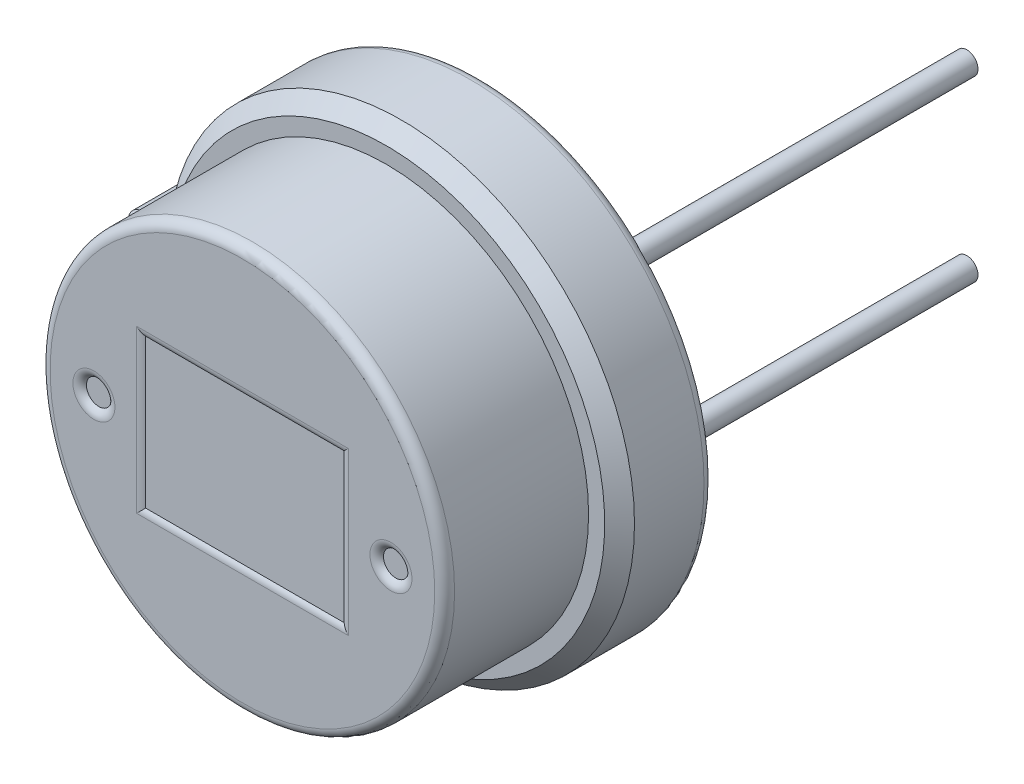
ISO-10303-21;
HEADER;
FILE_DESCRIPTION(('STEP AP214'),'2;1');
FILE_NAME('part.step','',(''),(''),'','','');
FILE_SCHEMA(('AUTOMOTIVE_DESIGN { 1 0 10303 214 1 1 1 1 }'));
ENDSEC;
DATA;
#1=APPLICATION_CONTEXT('core data for automotive mechanical design processes');
#2=APPLICATION_PROTOCOL_DEFINITION('international standard','automotive_design',2000,#1);
#3=PRODUCT_CONTEXT('',#1,'mechanical');
#4=PRODUCT('Part','Part','',(#3));
#5=PRODUCT_RELATED_PRODUCT_CATEGORY('part','',(#4));
#6=PRODUCT_DEFINITION_FORMATION('','',#4);
#7=PRODUCT_DEFINITION_CONTEXT('part definition',#1,'design');
#8=PRODUCT_DEFINITION('design','',#6,#7);
#9=PRODUCT_DEFINITION_SHAPE('','',#8);
#10=(LENGTH_UNIT() NAMED_UNIT(*) SI_UNIT(.MILLI.,.METRE.));
#11=(NAMED_UNIT(*) PLANE_ANGLE_UNIT() SI_UNIT($,.RADIAN.));
#12=(NAMED_UNIT(*) SI_UNIT($,.STERADIAN.) SOLID_ANGLE_UNIT());
#13=UNCERTAINTY_MEASURE_WITH_UNIT(LENGTH_MEASURE(1.E-05),#10,'distance_accuracy_value','');
#14=(GEOMETRIC_REPRESENTATION_CONTEXT(3) GLOBAL_UNCERTAINTY_ASSIGNED_CONTEXT((#13)) GLOBAL_UNIT_ASSIGNED_CONTEXT((#10,
#11,#12)) REPRESENTATION_CONTEXT('',''));
#15=CARTESIAN_POINT('',(0.,0.,0.));
#16=DIRECTION('',(0.,0.,1.));
#17=DIRECTION('',(1.,0.,0.));
#18=AXIS2_PLACEMENT_3D('',#15,#16,#17);
#19=CARTESIAN_POINT('',(-4.93558507170123,-0.800000000000001,1.9));
#20=DIRECTION('',(0.,0.,-1.));
#21=DIRECTION('',(-1.,0.,0.));
#22=AXIS2_PLACEMENT_3D('',#19,#20,#21);
#23=CYLINDRICAL_SURFACE('',#22,0.3);
#24=DIRECTION('',(0.,0.,-1.));
#25=VECTOR('',#24,1.);
#26=CARTESIAN_POINT('',(-4.93558507170123,-0.500000000000002,1.9));
#27=LINE('',#26,#25);
#28=CARTESIAN_POINT('',(-4.93558507170123,-0.500000000000002,1.60000000000001));
#29=VERTEX_POINT('',#28);
#30=CARTESIAN_POINT('',(-4.93558507170123,-0.500000000000002,0.200000000000001));
#31=VERTEX_POINT('',#30);
#32=EDGE_CURVE('E209',#29,#31,#27,.T.);
#33=ORIENTED_EDGE('',*,*,#32,.T.);
#34=CARTESIAN_POINT('',(-4.93558507170123,-0.800000000000001,0.2));
#35=DIRECTION('',(0.,0.,1.));
#36=DIRECTION('',(1.,0.,0.));
#37=AXIS2_PLACEMENT_3D('',#34,#35,#36);
#38=CIRCLE('',#37,0.3);
#39=CARTESIAN_POINT('',(-4.63944996739915,-0.752000000000001,0.200000000000001));
#40=VERTEX_POINT('',#39);
#41=EDGE_CURVE('E301',#31,#40,#38,.F.);
#42=ORIENTED_EDGE('',*,*,#41,.T.);
#43=DIRECTION('',(0.,0.,-1.));
#44=VECTOR('',#43,1.);
#45=CARTESIAN_POINT('',(-4.63944996739915,-0.752000000000001,1.9));
#46=LINE('',#45,#44);
#47=CARTESIAN_POINT('',(-4.63944996739915,-0.752000000000001,1.60000000000001));
#48=VERTEX_POINT('',#47);
#49=EDGE_CURVE('E215',#48,#40,#46,.T.);
#50=ORIENTED_EDGE('',*,*,#49,.F.);
#51=CARTESIAN_POINT('',(-4.93558507170123,-0.800000000000001,1.60000000000001));
#52=DIRECTION('',(0.,0.,1.));
#53=DIRECTION('',(1.,0.,0.));
#54=AXIS2_PLACEMENT_3D('',#51,#52,#53);
#55=CIRCLE('',#54,0.3);
#56=EDGE_CURVE('E292',#48,#29,#55,.T.);
#57=ORIENTED_EDGE('',*,*,#56,.T.);
#58=EDGE_LOOP('',(#33,#42,#50,#57));
#59=FACE_BOUND('',#58,.T.);
#60=ADVANCED_FACE('F40',(#59),#23,.F.);
#61=CARTESIAN_POINT('',(0.,0.,1.9));
#62=DIRECTION('',(0.,0.,-1.));
#63=DIRECTION('',(-1.,0.,0.));
#64=AXIS2_PLACEMENT_3D('',#61,#62,#63);
#65=CYLINDRICAL_SURFACE('',#64,4.7);
#66=ORIENTED_EDGE('',*,*,#49,.T.);
#67=CARTESIAN_POINT('',(0.,0.,0.2));
#68=DIRECTION('',(0.,0.,1.));
#69=DIRECTION('',(1.,0.,0.));
#70=AXIS2_PLACEMENT_3D('',#67,#68,#69);
#71=CIRCLE('',#70,4.7);
#72=CARTESIAN_POINT('',(-4.63944996739915,0.751999999999998,0.200000000000001));
#73=VERTEX_POINT('',#72);
#74=EDGE_CURVE('E11',#40,#73,#71,.T.);
#75=ORIENTED_EDGE('',*,*,#74,.T.);
#76=DIRECTION('',(0.,0.,-1.));
#77=VECTOR('',#76,1.);
#78=CARTESIAN_POINT('',(-4.63944996739915,0.751999999999998,1.9));
#79=LINE('',#78,#77);
#80=CARTESIAN_POINT('',(-4.63944996739915,0.751999999999998,1.60000000000001));
#81=VERTEX_POINT('',#80);
#82=EDGE_CURVE('E239',#81,#73,#79,.T.);
#83=ORIENTED_EDGE('',*,*,#82,.F.);
#84=CARTESIAN_POINT('',(0.,0.,1.60000000000001));
#85=DIRECTION('',(0.,0.,1.));
#86=DIRECTION('',(1.,0.,0.));
#87=AXIS2_PLACEMENT_3D('',#84,#85,#86);
#88=CIRCLE('',#87,4.7);
#89=EDGE_CURVE('E298',#81,#48,#88,.F.);
#90=ORIENTED_EDGE('',*,*,#89,.T.);
#91=EDGE_LOOP('',(#66,#75,#83,#90));
#92=FACE_BOUND('',#91,.T.);
#93=ADVANCED_FACE('F449',(#92),#65,.T.);
#94=CARTESIAN_POINT('',(-4.93558507170123,0.799999999999999,1.9));
#95=DIRECTION('',(0.,0.,-1.));
#96=DIRECTION('',(-1.,0.,0.));
#97=AXIS2_PLACEMENT_3D('',#94,#95,#96);
#98=CYLINDRICAL_SURFACE('',#97,0.3);
#99=ORIENTED_EDGE('',*,*,#82,.T.);
#100=CARTESIAN_POINT('',(-4.93558507170123,0.799999999999999,0.2));
#101=DIRECTION('',(0.,0.,1.));
#102=DIRECTION('',(1.,0.,0.));
#103=AXIS2_PLACEMENT_3D('',#100,#101,#102);
#104=CIRCLE('',#103,0.3);
#105=CARTESIAN_POINT('',(-4.93558507170123,0.499999999999999,0.200000000000001));
#106=VERTEX_POINT('',#105);
#107=EDGE_CURVE('E375',#73,#106,#104,.F.);
#108=ORIENTED_EDGE('',*,*,#107,.T.);
#109=DIRECTION('',(0.,0.,-1.));
#110=VECTOR('',#109,1.);
#111=CARTESIAN_POINT('',(-4.93558507170123,0.499999999999999,1.9));
#112=LINE('',#111,#110);
#113=CARTESIAN_POINT('',(-4.93558507170123,0.499999999999999,1.60000000000001));
#114=VERTEX_POINT('',#113);
#115=EDGE_CURVE('E235',#114,#106,#112,.T.);
#116=ORIENTED_EDGE('',*,*,#115,.F.);
#117=CARTESIAN_POINT('',(-4.93558507170123,0.799999999999999,1.60000000000001));
#118=DIRECTION('',(0.,0.,1.));
#119=DIRECTION('',(1.,0.,0.));
#120=AXIS2_PLACEMENT_3D('',#117,#118,#119);
#121=CIRCLE('',#120,0.3);
#122=EDGE_CURVE('E295',#114,#81,#121,.T.);
#123=ORIENTED_EDGE('',*,*,#122,.T.);
#124=EDGE_LOOP('',(#99,#108,#116,#123));
#125=FACE_BOUND('',#124,.T.);
#126=ADVANCED_FACE('F455',(#125),#98,.F.);
#127=CARTESIAN_POINT('',(-5.2,0.499999999999999,1.9));
#128=DIRECTION('',(0.,-1.,0.));
#129=DIRECTION('',(1.,0.,0.));
#130=AXIS2_PLACEMENT_3D('',#127,#128,#129);
#131=PLANE('',#130);
#132=ORIENTED_EDGE('',*,*,#115,.T.);
#133=DIRECTION('',(-1.,0.,0.));
#134=VECTOR('',#133,1.);
#135=CARTESIAN_POINT('',(-5.2,0.499999999999999,0.2));
#136=LINE('',#135,#134);
#137=CARTESIAN_POINT('',(-5.2,0.499999999999999,0.200000000000001));
#138=VERTEX_POINT('',#137);
#139=EDGE_CURVE('E372',#106,#138,#136,.T.);
#140=ORIENTED_EDGE('',*,*,#139,.T.);
#141=DIRECTION('',(0.,0.,-1.));
#142=VECTOR('',#141,1.);
#143=CARTESIAN_POINT('',(-5.2,0.499999999999999,1.9));
#144=LINE('',#143,#142);
#145=CARTESIAN_POINT('',(-5.2,0.499999999999999,1.60000000000001));
#146=VERTEX_POINT('',#145);
#147=EDGE_CURVE('E231',#146,#138,#144,.T.);
#148=ORIENTED_EDGE('',*,*,#147,.F.);
#149=DIRECTION('',(1.,0.,0.));
#150=VECTOR('',#149,1.);
#151=CARTESIAN_POINT('',(-4.93558507170123,0.499999999999999,1.60000000000001));
#152=LINE('',#151,#150);
#153=EDGE_CURVE('E289',#146,#114,#152,.T.);
#154=ORIENTED_EDGE('',*,*,#153,.T.);
#155=EDGE_LOOP('',(#132,#140,#148,#154));
#156=FACE_BOUND('',#155,.T.);
#157=ADVANCED_FACE('F630',(#156),#131,.F.);
#158=CARTESIAN_POINT('',(-5.2,0.199999999999999,1.9));
#159=DIRECTION('',(0.,0.,-1.));
#160=DIRECTION('',(-1.,0.,0.));
#161=AXIS2_PLACEMENT_3D('',#158,#159,#160);
#162=CYLINDRICAL_SURFACE('',#161,0.3);
#163=ORIENTED_EDGE('',*,*,#147,.T.);
#164=CARTESIAN_POINT('',(-5.2,0.199999999999999,0.199999999999999));
#165=DIRECTION('',(0.,0.,1.));
#166=DIRECTION('',(1.,0.,0.));
#167=AXIS2_PLACEMENT_3D('',#164,#165,#166);
#168=CIRCLE('',#167,0.3);
#169=CARTESIAN_POINT('',(-5.5,0.199999999999997,0.2));
#170=VERTEX_POINT('',#169);
#171=EDGE_CURVE('E369',#138,#170,#168,.T.);
#172=ORIENTED_EDGE('',*,*,#171,.T.);
#173=DIRECTION('',(0.,0.,-1.));
#174=VECTOR('',#173,1.);
#175=CARTESIAN_POINT('',(-5.5,0.199999999999997,1.9));
#176=LINE('',#175,#174);
#177=CARTESIAN_POINT('',(-5.5,0.199999999999997,1.60000000000001));
#178=VERTEX_POINT('',#177);
#179=EDGE_CURVE('E227',#178,#170,#176,.T.);
#180=ORIENTED_EDGE('',*,*,#179,.F.);
#181=CARTESIAN_POINT('',(-5.2,0.199999999999999,1.60000000000001));
#182=DIRECTION('',(0.,0.,1.));
#183=DIRECTION('',(1.,0.,0.));
#184=AXIS2_PLACEMENT_3D('',#181,#182,#183);
#185=CIRCLE('',#184,0.3);
#186=EDGE_CURVE('E283',#178,#146,#185,.F.);
#187=ORIENTED_EDGE('',*,*,#186,.T.);
#188=EDGE_LOOP('',(#163,#172,#180,#187));
#189=FACE_BOUND('',#188,.T.);
#190=ADVANCED_FACE('F626',(#189),#162,.T.);
#191=CARTESIAN_POINT('',(-5.5,0.199999999999997,1.9));
#192=DIRECTION('',(1.,0.,0.));
#193=DIRECTION('',(0.,0.,-1.));
#194=AXIS2_PLACEMENT_3D('',#191,#192,#193);
#195=PLANE('',#194);
#196=ORIENTED_EDGE('',*,*,#179,.T.);
#197=DIRECTION('',(0.,-1.,0.));
#198=VECTOR('',#197,1.);
#199=CARTESIAN_POINT('',(-5.5,0.199999999999997,0.2));
#200=LINE('',#199,#198);
#201=CARTESIAN_POINT('',(-5.5,-0.199999999999999,0.200000000000001));
#202=VERTEX_POINT('',#201);
#203=EDGE_CURVE('E367',#170,#202,#200,.T.);
#204=ORIENTED_EDGE('',*,*,#203,.T.);
#205=DIRECTION('',(0.,0.,-1.));
#206=VECTOR('',#205,1.);
#207=CARTESIAN_POINT('',(-5.5,-0.199999999999999,1.9));
#208=LINE('',#207,#206);
#209=CARTESIAN_POINT('',(-5.5,-0.199999999999999,1.60000000000001));
#210=VERTEX_POINT('',#209);
#211=EDGE_CURVE('E223',#210,#202,#208,.T.);
#212=ORIENTED_EDGE('',*,*,#211,.F.);
#213=DIRECTION('',(0.,1.,0.));
#214=VECTOR('',#213,1.);
#215=CARTESIAN_POINT('',(-5.5,0.199999999999997,1.60000000000001));
#216=LINE('',#215,#214);
#217=EDGE_CURVE('E276',#210,#178,#216,.T.);
#218=ORIENTED_EDGE('',*,*,#217,.T.);
#219=EDGE_LOOP('',(#196,#204,#212,#218));
#220=FACE_BOUND('',#219,.T.);
#221=ADVANCED_FACE('F622',(#220),#195,.F.);
#222=CARTESIAN_POINT('',(-5.2,-0.200000000000002,1.9));
#223=DIRECTION('',(0.,0.,-1.));
#224=DIRECTION('',(-1.,0.,0.));
#225=AXIS2_PLACEMENT_3D('',#222,#223,#224);
#226=CYLINDRICAL_SURFACE('',#225,0.3);
#227=ORIENTED_EDGE('',*,*,#211,.T.);
#228=CARTESIAN_POINT('',(-5.2,-0.200000000000002,0.199999999999999));
#229=DIRECTION('',(0.,0.,1.));
#230=DIRECTION('',(1.,0.,0.));
#231=AXIS2_PLACEMENT_3D('',#228,#229,#230);
#232=CIRCLE('',#231,0.3);
#233=CARTESIAN_POINT('',(-5.2,-0.500000000000001,0.2));
#234=VERTEX_POINT('',#233);
#235=EDGE_CURVE('E364',#202,#234,#232,.T.);
#236=ORIENTED_EDGE('',*,*,#235,.T.);
#237=DIRECTION('',(0.,0.,-1.));
#238=VECTOR('',#237,1.);
#239=CARTESIAN_POINT('',(-5.2,-0.500000000000001,1.9));
#240=LINE('',#239,#238);
#241=CARTESIAN_POINT('',(-5.2,-0.500000000000001,1.60000000000001));
#242=VERTEX_POINT('',#241);
#243=EDGE_CURVE('E219',#242,#234,#240,.T.);
#244=ORIENTED_EDGE('',*,*,#243,.F.);
#245=CARTESIAN_POINT('',(-5.2,-0.200000000000002,1.60000000000001));
#246=DIRECTION('',(0.,0.,1.));
#247=DIRECTION('',(1.,0.,0.));
#248=AXIS2_PLACEMENT_3D('',#245,#246,#247);
#249=CIRCLE('',#248,0.3);
#250=EDGE_CURVE('E280',#242,#210,#249,.F.);
#251=ORIENTED_EDGE('',*,*,#250,.T.);
#252=EDGE_LOOP('',(#227,#236,#244,#251));
#253=FACE_BOUND('',#252,.T.);
#254=ADVANCED_FACE('F618',(#253),#226,.T.);
#255=CARTESIAN_POINT('',(-5.2,-0.500000000000001,1.9));
#256=DIRECTION('',(0.,1.,0.));
#257=DIRECTION('',(-1.,0.,0.));
#258=AXIS2_PLACEMENT_3D('',#255,#256,#257);
#259=PLANE('',#258);
#260=ORIENTED_EDGE('',*,*,#243,.T.);
#261=DIRECTION('',(1.,0.,0.));
#262=VECTOR('',#261,1.);
#263=CARTESIAN_POINT('',(-5.2,-0.500000000000001,0.2));
#264=LINE('',#263,#262);
#265=EDGE_CURVE('E361',#234,#31,#264,.T.);
#266=ORIENTED_EDGE('',*,*,#265,.T.);
#267=ORIENTED_EDGE('',*,*,#32,.F.);
#268=DIRECTION('',(-1.,0.,0.));
#269=VECTOR('',#268,1.);
#270=CARTESIAN_POINT('',(-5.2,-0.500000000000001,1.60000000000001));
#271=LINE('',#270,#269);
#272=EDGE_CURVE('E286',#29,#242,#271,.T.);
#273=ORIENTED_EDGE('',*,*,#272,.T.);
#274=EDGE_LOOP('',(#260,#266,#267,#273));
#275=FACE_BOUND('',#274,.T.);
#276=ADVANCED_FACE('F613',(#275),#259,.F.);
#277=CARTESIAN_POINT('',(-4.93558507170123,-0.800000000000001,1.9));
#278=DIRECTION('',(0.,0.,1.));
#279=DIRECTION('',(1.,0.,0.));
#280=AXIS2_PLACEMENT_3D('',#277,#278,#279);
#281=PLANE('',#280);
#282=DIRECTION('',(-1.,0.,0.));
#283=VECTOR('',#282,1.);
#284=CARTESIAN_POINT('',(-5.2,0.200000000000007,1.9));
#285=LINE('',#284,#283);
#286=CARTESIAN_POINT('',(-4.93558507170123,0.200000000000007,1.9));
#287=VERTEX_POINT('',#286);
#288=CARTESIAN_POINT('',(-5.2,0.200000000000007,1.9));
#289=VERTEX_POINT('',#288);
#290=EDGE_CURVE('E266',#287,#289,#285,.T.);
#291=ORIENTED_EDGE('',*,*,#290,.T.);
#292=DIRECTION('',(0.,-1.,0.));
#293=VECTOR('',#292,1.);
#294=CARTESIAN_POINT('',(-5.20000000000001,-0.199999999999999,1.9));
#295=LINE('',#294,#293);
#296=CARTESIAN_POINT('',(-5.2,-0.200000000000009,1.9));
#297=VERTEX_POINT('',#296);
#298=EDGE_CURVE('E272',#289,#297,#295,.T.);
#299=ORIENTED_EDGE('',*,*,#298,.T.);
#300=DIRECTION('',(1.,0.,0.));
#301=VECTOR('',#300,1.);
#302=CARTESIAN_POINT('',(-4.93558507170123,-0.20000000000001,1.9));
#303=LINE('',#302,#301);
#304=CARTESIAN_POINT('',(-4.93558507170123,-0.20000000000001,1.9));
#305=VERTEX_POINT('',#304);
#306=EDGE_CURVE('E269',#297,#305,#303,.T.);
#307=ORIENTED_EDGE('',*,*,#306,.T.);
#308=CARTESIAN_POINT('',(-4.93558507170123,-0.800000000000001,1.9));
#309=DIRECTION('',(0.,0.,1.));
#310=DIRECTION('',(1.,0.,0.));
#311=AXIS2_PLACEMENT_3D('',#308,#309,#310);
#312=CIRCLE('',#311,0.599999999999992);
#313=CARTESIAN_POINT('',(-4.34331486309709,-0.704000000000002,1.9));
#314=VERTEX_POINT('',#313);
#315=EDGE_CURVE('E263',#305,#314,#312,.F.);
#316=ORIENTED_EDGE('',*,*,#315,.T.);
#317=CARTESIAN_POINT('',(0.,0.,1.9));
#318=DIRECTION('',(0.,0.,1.));
#319=DIRECTION('',(1.,0.,0.));
#320=AXIS2_PLACEMENT_3D('',#317,#318,#319);
#321=CIRCLE('',#320,4.40000000000001);
#322=CARTESIAN_POINT('',(-4.34331486309709,0.703999999999999,1.9));
#323=VERTEX_POINT('',#322);
#324=EDGE_CURVE('E257',#314,#323,#321,.T.);
#325=ORIENTED_EDGE('',*,*,#324,.T.);
#326=CARTESIAN_POINT('',(-4.93558507170123,0.799999999999999,1.9));
#327=DIRECTION('',(0.,0.,1.));
#328=DIRECTION('',(1.,0.,0.));
#329=AXIS2_PLACEMENT_3D('',#326,#327,#328);
#330=CIRCLE('',#329,0.599999999999992);
#331=EDGE_CURVE('E260',#323,#287,#330,.F.);
#332=ORIENTED_EDGE('',*,*,#331,.T.);
#333=EDGE_LOOP('',(#291,#299,#307,#316,#325,#332));
#334=FACE_BOUND('',#333,.T.);
#335=CARTESIAN_POINT('',(0.,0.,1.9));
#336=DIRECTION('',(0.,0.,1.));
#337=DIRECTION('',(1.,0.,0.));
#338=AXIS2_PLACEMENT_3D('',#335,#336,#337);
#339=CIRCLE('',#338,4.075);
#340=CARTESIAN_POINT('',(4.075,0.,1.9));
#341=VERTEX_POINT('',#340);
#342=EDGE_CURVE('E210',#341,#341,#339,.T.);
#343=ORIENTED_EDGE('',*,*,#342,.F.);
#344=EDGE_LOOP('',(#343));
#345=FACE_BOUND('',#344,.T.);
#346=ADVANCED_FACE('F579',(#334,#345),#281,.T.);
#347=CARTESIAN_POINT('',(-4.93558507170123,-0.800000000000001,0.));
#348=DIRECTION('',(0.,0.,1.));
#349=DIRECTION('',(1.,0.,0.));
#350=AXIS2_PLACEMENT_3D('',#347,#348,#349);
#351=PLANE('',#350);
#352=CARTESIAN_POINT('',(0.,0.,0.));
#353=DIRECTION('',(0.,0.,1.));
#354=DIRECTION('',(1.,0.,0.));
#355=AXIS2_PLACEMENT_3D('',#352,#353,#354);
#356=CIRCLE('',#355,4.5);
#357=CARTESIAN_POINT('',(-4.4420265645311,0.719999999999998,0.));
#358=VERTEX_POINT('',#357);
#359=CARTESIAN_POINT('',(-4.4420265645311,-0.720000000000001,0.));
#360=VERTEX_POINT('',#359);
#361=EDGE_CURVE('E336',#358,#360,#356,.F.);
#362=ORIENTED_EDGE('',*,*,#361,.T.);
#363=CARTESIAN_POINT('',(-4.93558507170123,-0.800000000000001,0.));
#364=DIRECTION('',(0.,0.,1.));
#365=DIRECTION('',(1.,0.,0.));
#366=AXIS2_PLACEMENT_3D('',#363,#364,#365);
#367=CIRCLE('',#366,0.5);
#368=CARTESIAN_POINT('',(-4.93558507170123,-0.300000000000002,0.));
#369=VERTEX_POINT('',#368);
#370=EDGE_CURVE('E357',#360,#369,#367,.T.);
#371=ORIENTED_EDGE('',*,*,#370,.T.);
#372=DIRECTION('',(1.,0.,0.));
#373=VECTOR('',#372,1.);
#374=CARTESIAN_POINT('',(-4.93558507170123,-0.300000000000002,0.));
#375=LINE('',#374,#373);
#376=CARTESIAN_POINT('',(-5.2,-0.300000000000001,0.));
#377=VERTEX_POINT('',#376);
#378=EDGE_CURVE('E354',#369,#377,#375,.F.);
#379=ORIENTED_EDGE('',*,*,#378,.T.);
#380=CARTESIAN_POINT('',(-5.2,-0.200000000000002,0.));
#381=DIRECTION('',(0.,0.,1.));
#382=DIRECTION('',(1.,0.,0.));
#383=AXIS2_PLACEMENT_3D('',#380,#381,#382);
#384=CIRCLE('',#383,0.0999999999999999);
#385=CARTESIAN_POINT('',(-5.3,-0.200000000000001,0.));
#386=VERTEX_POINT('',#385);
#387=EDGE_CURVE('E351',#377,#386,#384,.F.);
#388=ORIENTED_EDGE('',*,*,#387,.T.);
#389=DIRECTION('',(0.,-1.,0.));
#390=VECTOR('',#389,1.);
#391=CARTESIAN_POINT('',(-5.3,-0.800000000000001,0.));
#392=LINE('',#391,#390);
#393=CARTESIAN_POINT('',(-5.3,0.199999999999997,0.));
#394=VERTEX_POINT('',#393);
#395=EDGE_CURVE('E348',#386,#394,#392,.F.);
#396=ORIENTED_EDGE('',*,*,#395,.T.);
#397=CARTESIAN_POINT('',(-5.2,0.199999999999999,0.));
#398=DIRECTION('',(0.,0.,1.));
#399=DIRECTION('',(1.,0.,0.));
#400=AXIS2_PLACEMENT_3D('',#397,#398,#399);
#401=CIRCLE('',#400,0.0999999999999999);
#402=CARTESIAN_POINT('',(-5.2,0.299999999999999,0.));
#403=VERTEX_POINT('',#402);
#404=EDGE_CURVE('E345',#394,#403,#401,.F.);
#405=ORIENTED_EDGE('',*,*,#404,.T.);
#406=DIRECTION('',(-1.,0.,0.));
#407=VECTOR('',#406,1.);
#408=CARTESIAN_POINT('',(-4.93558507170123,0.299999999999999,0.));
#409=LINE('',#408,#407);
#410=CARTESIAN_POINT('',(-4.93558507170123,0.299999999999999,0.));
#411=VERTEX_POINT('',#410);
#412=EDGE_CURVE('E342',#403,#411,#409,.F.);
#413=ORIENTED_EDGE('',*,*,#412,.T.);
#414=CARTESIAN_POINT('',(-4.93558507170123,0.799999999999999,0.));
#415=DIRECTION('',(0.,0.,1.));
#416=DIRECTION('',(1.,0.,0.));
#417=AXIS2_PLACEMENT_3D('',#414,#415,#416);
#418=CIRCLE('',#417,0.5);
#419=EDGE_CURVE('E339',#411,#358,#418,.T.);
#420=ORIENTED_EDGE('',*,*,#419,.T.);
#421=EDGE_LOOP('',(#362,#371,#379,#388,#396,#405,#413,#420));
#422=FACE_BOUND('',#421,.T.);
#423=CARTESIAN_POINT('',(1.79605122421384,1.79605122421382,0.));
#424=DIRECTION('',(0.,0.,1.));
#425=DIRECTION('',(1.,0.,0.));
#426=AXIS2_PLACEMENT_3D('',#423,#424,#425);
#427=CIRCLE('',#426,0.225000000000001);
#428=CARTESIAN_POINT('',(2.02105122421384,1.79605122421382,0.));
#429=VERTEX_POINT('',#428);
#430=EDGE_CURVE('E253',#429,#429,#427,.F.);
#431=ORIENTED_EDGE('',*,*,#430,.F.);
#432=EDGE_LOOP('',(#431));
#433=FACE_BOUND('',#432,.T.);
#434=CARTESIAN_POINT('',(-1.79605122421384,-1.79605122421382,0.));
#435=DIRECTION('',(0.,0.,1.));
#436=DIRECTION('',(1.,0.,0.));
#437=AXIS2_PLACEMENT_3D('',#434,#435,#436);
#438=CIRCLE('',#437,0.225);
#439=CARTESIAN_POINT('',(-1.57105122421384,-1.79605122421382,0.));
#440=VERTEX_POINT('',#439);
#441=EDGE_CURVE('E249',#440,#440,#438,.F.);
#442=ORIENTED_EDGE('',*,*,#441,.F.);
#443=EDGE_LOOP('',(#442));
#444=FACE_BOUND('',#443,.T.);
#445=CARTESIAN_POINT('',(1.79605122421384,-1.79605122421382,0.));
#446=DIRECTION('',(0.,0.,1.));
#447=DIRECTION('',(1.,0.,0.));
#448=AXIS2_PLACEMENT_3D('',#445,#446,#447);
#449=CIRCLE('',#448,0.225);
#450=CARTESIAN_POINT('',(2.02105122421384,-1.79605122421382,0.));
#451=VERTEX_POINT('',#450);
#452=EDGE_CURVE('E214',#451,#451,#449,.F.);
#453=ORIENTED_EDGE('',*,*,#452,.F.);
#454=EDGE_LOOP('',(#453));
#455=FACE_BOUND('',#454,.T.);
#456=ADVANCED_FACE('F576',(#422,#433,#444,#455),#351,.F.);
#457=CARTESIAN_POINT('',(0.,0.,4.8));
#458=DIRECTION('',(0.,0.,-1.));
#459=DIRECTION('',(-1.,0.,0.));
#460=AXIS2_PLACEMENT_3D('',#457,#458,#459);
#461=CYLINDRICAL_SURFACE('',#460,4.075);
#462=CARTESIAN_POINT('',(0.,0.,4.6));
#463=DIRECTION('',(0.,0.,1.));
#464=DIRECTION('',(1.,0.,0.));
#465=AXIS2_PLACEMENT_3D('',#462,#463,#464);
#466=CIRCLE('',#465,4.075);
#467=CARTESIAN_POINT('',(4.075,0.,4.6));
#468=VERTEX_POINT('',#467);
#469=EDGE_CURVE('E50',#468,#468,#466,.F.);
#470=ORIENTED_EDGE('',*,*,#469,.T.);
#471=EDGE_LOOP('',(#470));
#472=FACE_BOUND('',#471,.T.);
#473=ORIENTED_EDGE('',*,*,#342,.T.);
#474=EDGE_LOOP('',(#473));
#475=FACE_BOUND('',#474,.T.);
#476=ADVANCED_FACE('F538',(#472,#475),#461,.T.);
#477=CARTESIAN_POINT('',(0.,0.,4.8));
#478=DIRECTION('',(0.,0.,1.));
#479=DIRECTION('',(1.,0.,0.));
#480=AXIS2_PLACEMENT_3D('',#477,#478,#479);
#481=PLANE('',#480);
#482=CARTESIAN_POINT('',(0.,0.,4.8));
#483=DIRECTION('',(0.,0.,1.));
#484=DIRECTION('',(1.,0.,0.));
#485=AXIS2_PLACEMENT_3D('',#482,#483,#484);
#486=CIRCLE('',#485,3.875);
#487=CARTESIAN_POINT('',(3.875,0.,4.8));
#488=VERTEX_POINT('',#487);
#489=EDGE_CURVE('E395',#488,#488,#486,.T.);
#490=ORIENTED_EDGE('',*,*,#489,.T.);
#491=EDGE_LOOP('',(#490));
#492=FACE_BOUND('',#491,.T.);
#493=DIRECTION('',(0.,-1.,0.));
#494=VECTOR('',#493,1.);
#495=CARTESIAN_POINT('',(-2.13228756555323,1.5,4.8));
#496=LINE('',#495,#494);
#497=CARTESIAN_POINT('',(-2.13228756555323,-1.63228756555323,4.8));
#498=VERTEX_POINT('',#497);
#499=CARTESIAN_POINT('',(-2.13228756555323,1.63228756555323,4.8));
#500=VERTEX_POINT('',#499);
#501=EDGE_CURVE('E58',#498,#500,#496,.F.);
#502=ORIENTED_EDGE('',*,*,#501,.T.);
#503=DIRECTION('',(-1.,0.,0.));
#504=VECTOR('',#503,1.);
#505=CARTESIAN_POINT('',(2.,1.63228756555323,4.8));
#506=LINE('',#505,#504);
#507=CARTESIAN_POINT('',(2.13228756555323,1.63228756555323,4.8));
#508=VERTEX_POINT('',#507);
#509=EDGE_CURVE('E392',#500,#508,#506,.F.);
#510=ORIENTED_EDGE('',*,*,#509,.T.);
#511=DIRECTION('',(0.,1.,0.));
#512=VECTOR('',#511,1.);
#513=CARTESIAN_POINT('',(2.13228756555323,-1.5,4.8));
#514=LINE('',#513,#512);
#515=CARTESIAN_POINT('',(2.13228756555323,-1.63228756555323,4.8));
#516=VERTEX_POINT('',#515);
#517=EDGE_CURVE('E189',#508,#516,#514,.F.);
#518=ORIENTED_EDGE('',*,*,#517,.T.);
#519=DIRECTION('',(1.,0.,0.));
#520=VECTOR('',#519,1.);
#521=CARTESIAN_POINT('',(-2.,-1.63228756555323,4.8));
#522=LINE('',#521,#520);
#523=EDGE_CURVE('E63',#516,#498,#522,.F.);
#524=ORIENTED_EDGE('',*,*,#523,.T.);
#525=EDGE_LOOP('',(#502,#510,#518,#524));
#526=FACE_BOUND('',#525,.T.);
#527=CARTESIAN_POINT('',(2.99263538753936,0.,4.8));
#528=DIRECTION('',(0.,0.,1.));
#529=DIRECTION('',(1.,0.,0.));
#530=AXIS2_PLACEMENT_3D('',#527,#528,#529);
#531=CIRCLE('',#530,0.423205080756889);
#532=CARTESIAN_POINT('',(3.41584046829624,0.,4.8));
#533=VERTEX_POINT('',#532);
#534=EDGE_CURVE('E382',#533,#533,#531,.F.);
#535=ORIENTED_EDGE('',*,*,#534,.T.);
#536=EDGE_LOOP('',(#535));
#537=FACE_BOUND('',#536,.T.);
#538=CARTESIAN_POINT('',(-2.99263538753936,0.,4.8));
#539=DIRECTION('',(0.,0.,1.));
#540=DIRECTION('',(1.,0.,0.));
#541=AXIS2_PLACEMENT_3D('',#538,#539,#540);
#542=CIRCLE('',#541,0.423205080756889);
#543=CARTESIAN_POINT('',(-2.56943030678247,0.,4.8));
#544=VERTEX_POINT('',#543);
#545=EDGE_CURVE('E378',#544,#544,#542,.F.);
#546=ORIENTED_EDGE('',*,*,#545,.T.);
#547=EDGE_LOOP('',(#546));
#548=FACE_BOUND('',#547,.T.);
#549=ADVANCED_FACE('F536',(#492,#526,#537,#548),#481,.T.);
#550=CARTESIAN_POINT('',(0.,0.,4.75));
#551=DIRECTION('',(0.,0.,1.));
#552=DIRECTION('',(1.,0.,0.));
#553=AXIS2_PLACEMENT_3D('',#550,#551,#552);
#554=PLANE('',#553);
#555=DIRECTION('',(0.,1.,0.));
#556=VECTOR('',#555,1.);
#557=CARTESIAN_POINT('',(2.,1.5,4.75));
#558=LINE('',#557,#556);
#559=CARTESIAN_POINT('',(2.,-1.5,4.75));
#560=VERTEX_POINT('',#559);
#561=CARTESIAN_POINT('',(2.,1.5,4.75));
#562=VERTEX_POINT('',#561);
#563=EDGE_CURVE('E173',#560,#562,#558,.T.);
#564=ORIENTED_EDGE('',*,*,#563,.T.);
#565=DIRECTION('',(-1.,0.,0.));
#566=VECTOR('',#565,1.);
#567=CARTESIAN_POINT('',(-2.,1.5,4.75));
#568=LINE('',#567,#566);
#569=CARTESIAN_POINT('',(-2.,1.5,4.75));
#570=VERTEX_POINT('',#569);
#571=EDGE_CURVE('E177',#562,#570,#568,.T.);
#572=ORIENTED_EDGE('',*,*,#571,.T.);
#573=DIRECTION('',(0.,-1.,0.));
#574=VECTOR('',#573,1.);
#575=CARTESIAN_POINT('',(-2.,1.5,4.75));
#576=LINE('',#575,#574);
#577=CARTESIAN_POINT('',(-2.,-1.5,4.75));
#578=VERTEX_POINT('',#577);
#579=EDGE_CURVE('E199',#570,#578,#576,.T.);
#580=ORIENTED_EDGE('',*,*,#579,.T.);
#581=DIRECTION('',(1.,0.,0.));
#582=VECTOR('',#581,1.);
#583=CARTESIAN_POINT('',(-2.,-1.5,4.75));
#584=LINE('',#583,#582);
#585=EDGE_CURVE('E179',#578,#560,#584,.T.);
#586=ORIENTED_EDGE('',*,*,#585,.T.);
#587=EDGE_LOOP('',(#564,#572,#580,#586));
#588=FACE_BOUND('',#587,.T.);
#589=ADVANCED_FACE('F175',(#588),#554,.T.);
#590=CARTESIAN_POINT('',(2.99263538753936,0.,4.7));
#591=DIRECTION('',(0.,0.,-1.));
#592=DIRECTION('',(-1.,0.,0.));
#593=AXIS2_PLACEMENT_3D('',#590,#591,#592);
#594=PLANE('',#593);
#595=CARTESIAN_POINT('',(2.99263538753936,0.,4.7));
#596=DIRECTION('',(0.,0.,1.));
#597=DIRECTION('',(-1.,0.,0.));
#598=AXIS2_PLACEMENT_3D('',#595,#596,#597);
#599=CIRCLE('',#598,0.25);
#600=CARTESIAN_POINT('',(2.74263538753936,0.,4.7));
#601=VERTEX_POINT('',#600);
#602=EDGE_CURVE('E551',#601,#601,#599,.T.);
#603=ORIENTED_EDGE('',*,*,#602,.T.);
#604=EDGE_LOOP('',(#603));
#605=FACE_BOUND('',#604,.T.);
#606=ADVANCED_FACE('F599',(#605),#594,.F.);
#607=CARTESIAN_POINT('',(-2.99263538753936,0.,4.7));
#608=DIRECTION('',(0.,0.,1.));
#609=DIRECTION('',(1.,0.,0.));
#610=AXIS2_PLACEMENT_3D('',#607,#608,#609);
#611=PLANE('',#610);
#612=CARTESIAN_POINT('',(-2.99263538753936,0.,4.7));
#613=DIRECTION('',(0.,0.,1.));
#614=DIRECTION('',(1.,0.,0.));
#615=AXIS2_PLACEMENT_3D('',#612,#613,#614);
#616=CIRCLE('',#615,0.25);
#617=CARTESIAN_POINT('',(-2.74263538753936,0.,4.7));
#618=VERTEX_POINT('',#617);
#619=EDGE_CURVE('E184',#618,#618,#616,.T.);
#620=ORIENTED_EDGE('',*,*,#619,.T.);
#621=EDGE_LOOP('',(#620));
#622=FACE_BOUND('',#621,.T.);
#623=ADVANCED_FACE('F589',(#622),#611,.T.);
#624=CARTESIAN_POINT('',(1.79605122421384,-1.79605122421382,-8.));
#625=DIRECTION('',(0.,0.,1.));
#626=DIRECTION('',(1.,0.,0.));
#627=AXIS2_PLACEMENT_3D('',#624,#625,#626);
#628=CYLINDRICAL_SURFACE('',#627,0.225);
#629=CARTESIAN_POINT('',(1.79605122421384,-1.79605122421382,-8.));
#630=DIRECTION('',(0.,0.,-1.));
#631=DIRECTION('',(-1.,0.,0.));
#632=AXIS2_PLACEMENT_3D('',#629,#630,#631);
#633=CIRCLE('',#632,0.225);
#634=CARTESIAN_POINT('',(1.57105122421384,-1.79605122421382,-8.));
#635=VERTEX_POINT('',#634);
#636=EDGE_CURVE('E555',#635,#635,#633,.T.);
#637=ORIENTED_EDGE('',*,*,#636,.F.);
#638=EDGE_LOOP('',(#637));
#639=FACE_BOUND('',#638,.T.);
#640=ORIENTED_EDGE('',*,*,#452,.T.);
#641=EDGE_LOOP('',(#640));
#642=FACE_BOUND('',#641,.T.);
#643=ADVANCED_FACE('F586',(#639,#642),#628,.T.);
#644=CARTESIAN_POINT('',(1.79605122421384,-1.79605122421382,-8.));
#645=DIRECTION('',(0.,0.,-1.));
#646=DIRECTION('',(-1.,0.,0.));
#647=AXIS2_PLACEMENT_3D('',#644,#645,#646);
#648=PLANE('',#647);
#649=ORIENTED_EDGE('',*,*,#636,.T.);
#650=EDGE_LOOP('',(#649));
#651=FACE_BOUND('',#650,.T.);
#652=ADVANCED_FACE('F588',(#651),#648,.T.);
#653=CARTESIAN_POINT('',(-1.79605122421384,-1.79605122421382,-8.));
#654=DIRECTION('',(0.,0.,1.));
#655=DIRECTION('',(1.,0.,0.));
#656=AXIS2_PLACEMENT_3D('',#653,#654,#655);
#657=CYLINDRICAL_SURFACE('',#656,0.225);
#658=CARTESIAN_POINT('',(-1.79605122421384,-1.79605122421382,-8.));
#659=DIRECTION('',(0.,0.,-1.));
#660=DIRECTION('',(1.,0.,0.));
#661=AXIS2_PLACEMENT_3D('',#658,#659,#660);
#662=CIRCLE('',#661,0.225);
#663=CARTESIAN_POINT('',(-1.57105122421384,-1.79605122421382,-8.));
#664=VERTEX_POINT('',#663);
#665=EDGE_CURVE('E560',#664,#664,#662,.T.);
#666=ORIENTED_EDGE('',*,*,#665,.F.);
#667=EDGE_LOOP('',(#666));
#668=FACE_BOUND('',#667,.T.);
#669=ORIENTED_EDGE('',*,*,#441,.T.);
#670=EDGE_LOOP('',(#669));
#671=FACE_BOUND('',#670,.T.);
#672=ADVANCED_FACE('F596',(#668,#671),#657,.T.);
#673=CARTESIAN_POINT('',(-1.79605122421384,-1.79605122421382,-8.));
#674=DIRECTION('',(0.,0.,1.));
#675=DIRECTION('',(1.,0.,0.));
#676=AXIS2_PLACEMENT_3D('',#673,#674,#675);
#677=PLANE('',#676);
#678=ORIENTED_EDGE('',*,*,#665,.T.);
#679=EDGE_LOOP('',(#678));
#680=FACE_BOUND('',#679,.T.);
#681=ADVANCED_FACE('F572',(#680),#677,.F.);
#682=CARTESIAN_POINT('',(1.79605122421384,1.79605122421382,-8.));
#683=DIRECTION('',(0.,0.,1.));
#684=DIRECTION('',(1.,0.,0.));
#685=AXIS2_PLACEMENT_3D('',#682,#683,#684);
#686=CYLINDRICAL_SURFACE('',#685,0.225000000000001);
#687=CARTESIAN_POINT('',(1.79605122421384,1.79605122421382,-8.));
#688=DIRECTION('',(0.,0.,-1.));
#689=DIRECTION('',(-1.,0.,0.));
#690=AXIS2_PLACEMENT_3D('',#687,#688,#689);
#691=CIRCLE('',#690,0.225000000000001);
#692=CARTESIAN_POINT('',(1.57105122421384,1.79605122421382,-8.));
#693=VERTEX_POINT('',#692);
#694=EDGE_CURVE('E332',#693,#693,#691,.T.);
#695=ORIENTED_EDGE('',*,*,#694,.F.);
#696=EDGE_LOOP('',(#695));
#697=FACE_BOUND('',#696,.T.);
#698=ORIENTED_EDGE('',*,*,#430,.T.);
#699=EDGE_LOOP('',(#698));
#700=FACE_BOUND('',#699,.T.);
#701=ADVANCED_FACE('F569',(#697,#700),#686,.T.);
#702=CARTESIAN_POINT('',(1.79605122421384,1.79605122421382,-8.));
#703=DIRECTION('',(0.,0.,-1.));
#704=DIRECTION('',(-1.,0.,0.));
#705=AXIS2_PLACEMENT_3D('',#702,#703,#704);
#706=PLANE('',#705);
#707=ORIENTED_EDGE('',*,*,#694,.T.);
#708=EDGE_LOOP('',(#707));
#709=FACE_BOUND('',#708,.T.);
#710=ADVANCED_FACE('F492',(#709),#706,.T.);
#711=CARTESIAN_POINT('',(0.,0.,1.9));
#712=DIRECTION('',(0.,0.,-1.));
#713=DIRECTION('',(-1.,0.,0.));
#714=AXIS2_PLACEMENT_3D('',#711,#712,#713);
#715=CONICAL_SURFACE('',#714,4.40000000000001,0.785398163397445);
#716=DIRECTION('',(0.697997134664605,0.113137084989848,0.707106781186549));
#717=VECTOR('',#716,1.);
#718=CARTESIAN_POINT('',(-4.63944996739915,-0.752000000000001,1.60000000000001));
#719=LINE('',#718,#717);
#720=EDGE_CURVE('E324',#48,#314,#719,.T.);
#721=ORIENTED_EDGE('',*,*,#720,.F.);
#722=ORIENTED_EDGE('',*,*,#89,.F.);
#723=DIRECTION('',(-0.697997134664603,0.113137084989849,-0.70710678118655));
#724=VECTOR('',#723,1.);
#725=CARTESIAN_POINT('',(-4.34331486309709,0.703999999999999,1.9));
#726=LINE('',#725,#724);
#727=EDGE_CURVE('E328',#323,#81,#726,.T.);
#728=ORIENTED_EDGE('',*,*,#727,.F.);
#729=ORIENTED_EDGE('',*,*,#324,.F.);
#730=EDGE_LOOP('',(#721,#722,#728,#729));
#731=FACE_BOUND('',#730,.T.);
#732=ADVANCED_FACE('F488',(#731),#715,.T.);
#733=CARTESIAN_POINT('',(-4.93558507170123,0.799999999999999,1.9));
#734=DIRECTION('',(0.,0.,1.));
#735=DIRECTION('',(1.,0.,0.));
#736=AXIS2_PLACEMENT_3D('',#733,#734,#735);
#737=CONICAL_SURFACE('',#736,0.599999999999992,0.785398163397445);
#738=ORIENTED_EDGE('',*,*,#727,.T.);
#739=ORIENTED_EDGE('',*,*,#122,.F.);
#740=DIRECTION('',(0.,0.707106781186545,-0.70710678118655));
#741=VECTOR('',#740,1.);
#742=CARTESIAN_POINT('',(-4.93558507170123,0.200000000000007,1.9));
#743=LINE('',#742,#741);
#744=EDGE_CURVE('E320',#287,#114,#743,.T.);
#745=ORIENTED_EDGE('',*,*,#744,.F.);
#746=ORIENTED_EDGE('',*,*,#331,.F.);
#747=EDGE_LOOP('',(#738,#739,#745,#746));
#748=FACE_BOUND('',#747,.T.);
#749=ADVANCED_FACE('F484',(#748),#737,.F.);
#750=CARTESIAN_POINT('',(-4.93558507170123,-0.800000000000001,1.9));
#751=DIRECTION('',(0.,0.,1.));
#752=DIRECTION('',(1.,0.,0.));
#753=AXIS2_PLACEMENT_3D('',#750,#751,#752);
#754=CONICAL_SURFACE('',#753,0.599999999999992,0.785398163397445);
#755=ORIENTED_EDGE('',*,*,#720,.T.);
#756=ORIENTED_EDGE('',*,*,#315,.F.);
#757=DIRECTION('',(0.,0.707106781186545,0.70710678118655));
#758=VECTOR('',#757,1.);
#759=CARTESIAN_POINT('',(-4.93558507170123,-0.500000000000002,1.60000000000001));
#760=LINE('',#759,#758);
#761=EDGE_CURVE('E317',#29,#305,#760,.T.);
#762=ORIENTED_EDGE('',*,*,#761,.F.);
#763=ORIENTED_EDGE('',*,*,#56,.F.);
#764=EDGE_LOOP('',(#755,#756,#762,#763));
#765=FACE_BOUND('',#764,.T.);
#766=ADVANCED_FACE('F480',(#765),#754,.F.);
#767=CARTESIAN_POINT('',(-4.93558507170123,0.200000000000007,1.9));
#768=DIRECTION('',(0.,0.70710678118655,0.707106781186545));
#769=DIRECTION('',(1.,0.,0.));
#770=AXIS2_PLACEMENT_3D('',#767,#768,#769);
#771=PLANE('',#770);
#772=ORIENTED_EDGE('',*,*,#744,.T.);
#773=ORIENTED_EDGE('',*,*,#153,.F.);
#774=DIRECTION('',(0.,0.707106781186545,-0.70710678118655));
#775=VECTOR('',#774,1.);
#776=CARTESIAN_POINT('',(-5.2,0.200000000000007,1.9));
#777=LINE('',#776,#775);
#778=EDGE_CURVE('E313',#289,#146,#777,.T.);
#779=ORIENTED_EDGE('',*,*,#778,.F.);
#780=ORIENTED_EDGE('',*,*,#290,.F.);
#781=EDGE_LOOP('',(#772,#773,#779,#780));
#782=FACE_BOUND('',#781,.T.);
#783=ADVANCED_FACE('F476',(#782),#771,.T.);
#784=CARTESIAN_POINT('',(-4.93558507170123,-0.20000000000001,1.9));
#785=DIRECTION('',(0.,-0.70710678118655,0.707106781186545));
#786=DIRECTION('',(-1.,0.,0.));
#787=AXIS2_PLACEMENT_3D('',#784,#785,#786);
#788=PLANE('',#787);
#789=ORIENTED_EDGE('',*,*,#761,.T.);
#790=ORIENTED_EDGE('',*,*,#306,.F.);
#791=DIRECTION('',(0.,0.707106781186545,0.70710678118655));
#792=VECTOR('',#791,1.);
#793=CARTESIAN_POINT('',(-5.2,-0.500000000000001,1.60000000000001));
#794=LINE('',#793,#792);
#795=EDGE_CURVE('E309',#242,#297,#794,.T.);
#796=ORIENTED_EDGE('',*,*,#795,.F.);
#797=ORIENTED_EDGE('',*,*,#272,.F.);
#798=EDGE_LOOP('',(#789,#790,#796,#797));
#799=FACE_BOUND('',#798,.T.);
#800=ADVANCED_FACE('F472',(#799),#788,.T.);
#801=CARTESIAN_POINT('',(-5.2,0.199999999999999,1.60000000000001));
#802=DIRECTION('',(0.,0.,-1.));
#803=DIRECTION('',(-1.,0.,0.));
#804=AXIS2_PLACEMENT_3D('',#801,#802,#803);
#805=CONICAL_SURFACE('',#804,0.299999999999992,0.785398163397445);
#806=ORIENTED_EDGE('',*,*,#778,.T.);
#807=ORIENTED_EDGE('',*,*,#186,.F.);
#808=DIRECTION('',(-0.707106781186545,0.,-0.70710678118655));
#809=VECTOR('',#808,1.);
#810=CARTESIAN_POINT('',(-5.20000000000001,0.199999999999997,1.9));
#811=LINE('',#810,#809);
#812=EDGE_CURVE('E305',#289,#178,#811,.T.);
#813=ORIENTED_EDGE('',*,*,#812,.F.);
#814=EDGE_LOOP('',(#806,#807,#813));
#815=FACE_BOUND('',#814,.T.);
#816=ADVANCED_FACE('F468',(#815),#805,.T.);
#817=CARTESIAN_POINT('',(-5.2,-0.200000000000002,1.60000000000001));
#818=DIRECTION('',(0.,0.,-1.));
#819=DIRECTION('',(-1.,0.,0.));
#820=AXIS2_PLACEMENT_3D('',#817,#818,#819);
#821=CONICAL_SURFACE('',#820,0.299999999999992,0.785398163397445);
#822=ORIENTED_EDGE('',*,*,#250,.F.);
#823=ORIENTED_EDGE('',*,*,#795,.T.);
#824=DIRECTION('',(0.707106781186545,0.,0.70710678118655));
#825=VECTOR('',#824,1.);
#826=CARTESIAN_POINT('',(-5.5,-0.199999999999999,1.60000000000001));
#827=LINE('',#826,#825);
#828=EDGE_CURVE('E302',#210,#297,#827,.T.);
#829=ORIENTED_EDGE('',*,*,#828,.F.);
#830=EDGE_LOOP('',(#822,#823,#829));
#831=FACE_BOUND('',#830,.T.);
#832=ADVANCED_FACE('F464',(#831),#821,.T.);
#833=CARTESIAN_POINT('',(-5.20000000000001,-0.800000000000001,1.9));
#834=DIRECTION('',(-0.70710678118655,0.,0.707106781186545));
#835=DIRECTION('',(0.,1.,0.));
#836=AXIS2_PLACEMENT_3D('',#833,#834,#835);
#837=PLANE('',#836);
#838=ORIENTED_EDGE('',*,*,#812,.T.);
#839=ORIENTED_EDGE('',*,*,#217,.F.);
#840=ORIENTED_EDGE('',*,*,#828,.T.);
#841=ORIENTED_EDGE('',*,*,#298,.F.);
#842=EDGE_LOOP('',(#838,#839,#840,#841));
#843=FACE_BOUND('',#842,.T.);
#844=ADVANCED_FACE('F460',(#843),#837,.T.);
#845=CARTESIAN_POINT('',(-5.2,0.199999999999999,0.2));
#846=DIRECTION('',(0.,0.,1.));
#847=DIRECTION('',(1.,0.,0.));
#848=AXIS2_PLACEMENT_3D('',#845,#846,#847);
#849=DEGENERATE_TOROIDAL_SURFACE('',#848,0.0999999999999999,0.2,.T.);
#850=CARTESIAN_POINT('',(-5.2,0.299999999999999,0.2));
#851=DIRECTION('',(1.,0.,0.));
#852=DIRECTION('',(0.,1.,0.));
#853=AXIS2_PLACEMENT_3D('',#850,#851,#852);
#854=CIRCLE('',#853,0.2);
#855=EDGE_CURVE('E424',#403,#138,#854,.T.);
#856=ORIENTED_EDGE('',*,*,#855,.F.);
#857=ORIENTED_EDGE('',*,*,#404,.F.);
#858=CARTESIAN_POINT('',(-5.3,0.199999999999998,0.2));
#859=DIRECTION('',(0.,-1.,0.));
#860=DIRECTION('',(0.,0.,-1.));
#861=AXIS2_PLACEMENT_3D('',#858,#859,#860);
#862=CIRCLE('',#861,0.2);
#863=EDGE_CURVE('E306',#170,#394,#862,.T.);
#864=ORIENTED_EDGE('',*,*,#863,.F.);
#865=ORIENTED_EDGE('',*,*,#171,.F.);
#866=EDGE_LOOP('',(#856,#857,#864,#865));
#867=FACE_BOUND('',#866,.T.);
#868=ADVANCED_FACE('F463',(#867),#849,.T.);
#869=CARTESIAN_POINT('',(-5.3,0.199999999999997,0.2));
#870=DIRECTION('',(0.,-1.,0.));
#871=DIRECTION('',(0.,0.,-1.));
#872=AXIS2_PLACEMENT_3D('',#869,#870,#871);
#873=CYLINDRICAL_SURFACE('',#872,0.2);
#874=ORIENTED_EDGE('',*,*,#863,.T.);
#875=ORIENTED_EDGE('',*,*,#395,.F.);
#876=CARTESIAN_POINT('',(-5.3,-0.199999999999999,0.2));
#877=DIRECTION('',(0.,-1.,0.));
#878=DIRECTION('',(0.,0.,-1.));
#879=AXIS2_PLACEMENT_3D('',#876,#877,#878);
#880=CIRCLE('',#879,0.2);
#881=EDGE_CURVE('E420',#202,#386,#880,.T.);
#882=ORIENTED_EDGE('',*,*,#881,.F.);
#883=ORIENTED_EDGE('',*,*,#203,.F.);
#884=EDGE_LOOP('',(#874,#875,#882,#883));
#885=FACE_BOUND('',#884,.T.);
#886=ADVANCED_FACE('F518',(#885),#873,.T.);
#887=CARTESIAN_POINT('',(-5.2,0.299999999999999,0.2));
#888=DIRECTION('',(-1.,0.,0.));
#889=DIRECTION('',(0.,-1.,0.));
#890=AXIS2_PLACEMENT_3D('',#887,#888,#889);
#891=CYLINDRICAL_SURFACE('',#890,0.2);
#892=ORIENTED_EDGE('',*,*,#855,.T.);
#893=ORIENTED_EDGE('',*,*,#139,.F.);
#894=CARTESIAN_POINT('',(-4.93558507170123,0.299999999999999,0.2));
#895=DIRECTION('',(1.,0.,0.));
#896=DIRECTION('',(0.,0.,-1.));
#897=AXIS2_PLACEMENT_3D('',#894,#895,#896);
#898=CIRCLE('',#897,0.2);
#899=EDGE_CURVE('E416',#411,#106,#898,.T.);
#900=ORIENTED_EDGE('',*,*,#899,.F.);
#901=ORIENTED_EDGE('',*,*,#412,.F.);
#902=EDGE_LOOP('',(#892,#893,#900,#901));
#903=FACE_BOUND('',#902,.T.);
#904=ADVANCED_FACE('F514',(#903),#891,.T.);
#905=CARTESIAN_POINT('',(-5.2,-0.200000000000002,0.2));
#906=DIRECTION('',(0.,0.,1.));
#907=DIRECTION('',(1.,0.,0.));
#908=AXIS2_PLACEMENT_3D('',#905,#906,#907);
#909=DEGENERATE_TOROIDAL_SURFACE('',#908,0.0999999999999999,0.2,.T.);
#910=ORIENTED_EDGE('',*,*,#881,.T.);
#911=ORIENTED_EDGE('',*,*,#387,.F.);
#912=CARTESIAN_POINT('',(-5.2,-0.300000000000001,0.2));
#913=DIRECTION('',(1.,0.,0.));
#914=DIRECTION('',(0.,0.,-1.));
#915=AXIS2_PLACEMENT_3D('',#912,#913,#914);
#916=CIRCLE('',#915,0.2);
#917=EDGE_CURVE('E412',#234,#377,#916,.T.);
#918=ORIENTED_EDGE('',*,*,#917,.F.);
#919=ORIENTED_EDGE('',*,*,#235,.F.);
#920=EDGE_LOOP('',(#910,#911,#918,#919));
#921=FACE_BOUND('',#920,.T.);
#922=ADVANCED_FACE('F510',(#921),#909,.T.);
#923=CARTESIAN_POINT('',(-4.93558507170123,0.799999999999999,0.2));
#924=DIRECTION('',(0.,0.,1.));
#925=DIRECTION('',(1.,0.,0.));
#926=AXIS2_PLACEMENT_3D('',#923,#924,#925);
#927=TOROIDAL_SURFACE('',#926,0.5,0.2);
#928=ORIENTED_EDGE('',*,*,#899,.T.);
#929=ORIENTED_EDGE('',*,*,#107,.F.);
#930=CARTESIAN_POINT('',(-4.4420265645311,0.719999999999998,0.2));
#931=DIRECTION('',(0.160000000000002,0.987117014340245,0.));
#932=DIRECTION('',(-0.987117014340245,0.160000000000002,0.));
#933=AXIS2_PLACEMENT_3D('',#930,#931,#932);
#934=CIRCLE('',#933,0.2);
#935=EDGE_CURVE('E408',#358,#73,#934,.T.);
#936=ORIENTED_EDGE('',*,*,#935,.F.);
#937=ORIENTED_EDGE('',*,*,#419,.F.);
#938=EDGE_LOOP('',(#928,#929,#936,#937));
#939=FACE_BOUND('',#938,.T.);
#940=ADVANCED_FACE('F506',(#939),#927,.T.);
#941=CARTESIAN_POINT('',(-5.2,-0.300000000000001,0.2));
#942=DIRECTION('',(1.,0.,0.));
#943=DIRECTION('',(0.,1.,0.));
#944=AXIS2_PLACEMENT_3D('',#941,#942,#943);
#945=CYLINDRICAL_SURFACE('',#944,0.2);
#946=ORIENTED_EDGE('',*,*,#917,.T.);
#947=ORIENTED_EDGE('',*,*,#378,.F.);
#948=CARTESIAN_POINT('',(-4.93558507170123,-0.300000000000002,0.2));
#949=DIRECTION('',(1.,0.,0.));
#950=DIRECTION('',(0.,0.,-1.));
#951=AXIS2_PLACEMENT_3D('',#948,#949,#950);
#952=CIRCLE('',#951,0.2);
#953=EDGE_CURVE('E405',#31,#369,#952,.T.);
#954=ORIENTED_EDGE('',*,*,#953,.F.);
#955=ORIENTED_EDGE('',*,*,#265,.F.);
#956=EDGE_LOOP('',(#946,#947,#954,#955));
#957=FACE_BOUND('',#956,.T.);
#958=ADVANCED_FACE('F502',(#957),#945,.T.);
#959=CARTESIAN_POINT('',(0.,0.,0.2));
#960=DIRECTION('',(0.,0.,1.));
#961=DIRECTION('',(1.,0.,0.));
#962=AXIS2_PLACEMENT_3D('',#959,#960,#961);
#963=TOROIDAL_SURFACE('',#962,4.5,0.2);
#964=ORIENTED_EDGE('',*,*,#935,.T.);
#965=ORIENTED_EDGE('',*,*,#74,.F.);
#966=CARTESIAN_POINT('',(-4.4420265645311,-0.720000000000001,0.2));
#967=DIRECTION('',(-0.160000000000001,0.987117014340245,0.));
#968=DIRECTION('',(-0.987117014340245,-0.160000000000001,0.));
#969=AXIS2_PLACEMENT_3D('',#966,#967,#968);
#970=CIRCLE('',#969,0.2);
#971=EDGE_CURVE('E402',#360,#40,#970,.T.);
#972=ORIENTED_EDGE('',*,*,#971,.F.);
#973=ORIENTED_EDGE('',*,*,#361,.F.);
#974=EDGE_LOOP('',(#964,#965,#972,#973));
#975=FACE_BOUND('',#974,.T.);
#976=ADVANCED_FACE('F498',(#975),#963,.T.);
#977=CARTESIAN_POINT('',(-4.93558507170123,-0.800000000000001,0.2));
#978=DIRECTION('',(0.,0.,1.));
#979=DIRECTION('',(1.,0.,0.));
#980=AXIS2_PLACEMENT_3D('',#977,#978,#979);
#981=TOROIDAL_SURFACE('',#980,0.5,0.2);
#982=ORIENTED_EDGE('',*,*,#953,.T.);
#983=ORIENTED_EDGE('',*,*,#370,.F.);
#984=ORIENTED_EDGE('',*,*,#971,.T.);
#985=ORIENTED_EDGE('',*,*,#41,.F.);
#986=EDGE_LOOP('',(#982,#983,#984,#985));
#987=FACE_BOUND('',#986,.T.);
#988=ADVANCED_FACE('F494',(#987),#981,.T.);
#989=CARTESIAN_POINT('',(0.,0.,4.6));
#990=DIRECTION('',(0.,0.,1.));
#991=DIRECTION('',(1.,0.,0.));
#992=AXIS2_PLACEMENT_3D('',#989,#990,#991);
#993=TOROIDAL_SURFACE('',#992,3.875,0.2);
#994=ORIENTED_EDGE('',*,*,#469,.F.);
#995=EDGE_LOOP('',(#994));
#996=FACE_BOUND('',#995,.T.);
#997=ORIENTED_EDGE('',*,*,#489,.F.);
#998=EDGE_LOOP('',(#997));
#999=FACE_BOUND('',#998,.T.);
#1000=ADVANCED_FACE('F497',(#996,#999),#993,.T.);
#1001=CARTESIAN_POINT('',(-2.,-1.63228756555323,4.6));
#1002=DIRECTION('',(-1.,0.,0.));
#1003=DIRECTION('',(0.,0.,1.));
#1004=AXIS2_PLACEMENT_3D('',#1001,#1002,#1003);
#1005=CYLINDRICAL_SURFACE('',#1004,0.2);
#1006=CARTESIAN_POINT('',(-2.13228756555323,-1.63228756555323,4.6));
#1007=DIRECTION('',(-0.707106781186548,0.707106781186547,0.));
#1008=DIRECTION('',(0.707106781186547,0.707106781186548,0.));
#1009=AXIS2_PLACEMENT_3D('',#1006,#1007,#1008);
#1010=ELLIPSE('',#1009,0.282842712474619,0.2);
#1011=EDGE_CURVE('E192',#498,#578,#1010,.T.);
#1012=ORIENTED_EDGE('',*,*,#1011,.F.);
#1013=ORIENTED_EDGE('',*,*,#523,.F.);
#1014=CARTESIAN_POINT('',(2.13228756555323,-1.63228756555323,4.6));
#1015=DIRECTION('',(-0.707106781186547,-0.707106781186547,0.));
#1016=DIRECTION('',(-0.707106781186547,0.707106781186547,0.));
#1017=AXIS2_PLACEMENT_3D('',#1014,#1015,#1016);
#1018=ELLIPSE('',#1017,0.282842712474619,0.2);
#1019=EDGE_CURVE('E44',#560,#516,#1018,.F.);
#1020=ORIENTED_EDGE('',*,*,#1019,.F.);
#1021=ORIENTED_EDGE('',*,*,#585,.F.);
#1022=EDGE_LOOP('',(#1012,#1013,#1020,#1021));
#1023=FACE_BOUND('',#1022,.T.);
#1024=ADVANCED_FACE('F437',(#1023),#1005,.T.);
#1025=CARTESIAN_POINT('',(2.13228756555323,1.5,4.6));
#1026=DIRECTION('',(0.,-1.,0.));
#1027=DIRECTION('',(0.,0.,-1.));
#1028=AXIS2_PLACEMENT_3D('',#1025,#1026,#1027);
#1029=CYLINDRICAL_SURFACE('',#1028,0.2);
#1030=ORIENTED_EDGE('',*,*,#1019,.T.);
#1031=ORIENTED_EDGE('',*,*,#517,.F.);
#1032=CARTESIAN_POINT('',(2.13228756555323,1.63228756555323,4.6));
#1033=DIRECTION('',(0.707106781186547,-0.707106781186547,0.));
#1034=DIRECTION('',(0.707106781186547,0.707106781186547,0.));
#1035=AXIS2_PLACEMENT_3D('',#1032,#1033,#1034);
#1036=ELLIPSE('',#1035,0.282842712474619,0.2);
#1037=EDGE_CURVE('E187',#562,#508,#1036,.F.);
#1038=ORIENTED_EDGE('',*,*,#1037,.F.);
#1039=ORIENTED_EDGE('',*,*,#563,.F.);
#1040=EDGE_LOOP('',(#1030,#1031,#1038,#1039));
#1041=FACE_BOUND('',#1040,.T.);
#1042=ADVANCED_FACE('F188',(#1041),#1029,.T.);
#1043=CARTESIAN_POINT('',(-2.13228756555323,1.5,4.6));
#1044=DIRECTION('',(0.,1.,0.));
#1045=DIRECTION('',(-1.,0.,0.));
#1046=AXIS2_PLACEMENT_3D('',#1043,#1044,#1045);
#1047=CYLINDRICAL_SURFACE('',#1046,0.2);
#1048=ORIENTED_EDGE('',*,*,#1011,.T.);
#1049=ORIENTED_EDGE('',*,*,#579,.F.);
#1050=CARTESIAN_POINT('',(-2.13228756555323,1.63228756555323,4.6));
#1051=DIRECTION('',(0.707106781186547,0.707106781186548,0.));
#1052=DIRECTION('',(0.707106781186548,-0.707106781186547,0.));
#1053=AXIS2_PLACEMENT_3D('',#1050,#1051,#1052);
#1054=ELLIPSE('',#1053,0.282842712474619,0.2);
#1055=EDGE_CURVE('E193',#500,#570,#1054,.T.);
#1056=ORIENTED_EDGE('',*,*,#1055,.F.);
#1057=ORIENTED_EDGE('',*,*,#501,.F.);
#1058=EDGE_LOOP('',(#1048,#1049,#1056,#1057));
#1059=FACE_BOUND('',#1058,.T.);
#1060=ADVANCED_FACE('F438',(#1059),#1047,.T.);
#1061=CARTESIAN_POINT('',(-2.,1.63228756555323,4.6));
#1062=DIRECTION('',(1.,0.,0.));
#1063=DIRECTION('',(0.,0.,-1.));
#1064=AXIS2_PLACEMENT_3D('',#1061,#1062,#1063);
#1065=CYLINDRICAL_SURFACE('',#1064,0.2);
#1066=ORIENTED_EDGE('',*,*,#1037,.T.);
#1067=ORIENTED_EDGE('',*,*,#509,.F.);
#1068=ORIENTED_EDGE('',*,*,#1055,.T.);
#1069=ORIENTED_EDGE('',*,*,#571,.F.);
#1070=EDGE_LOOP('',(#1066,#1067,#1068,#1069));
#1071=FACE_BOUND('',#1070,.T.);
#1072=ADVANCED_FACE('F195',(#1071),#1065,.T.);
#1073=CARTESIAN_POINT('',(2.99263538753936,0.,4.6));
#1074=DIRECTION('',(0.,0.,1.));
#1075=DIRECTION('',(1.,0.,0.));
#1076=AXIS2_PLACEMENT_3D('',#1073,#1074,#1075);
#1077=TOROIDAL_SURFACE('',#1076,0.423205080756889,0.2);
#1078=ORIENTED_EDGE('',*,*,#534,.F.);
#1079=EDGE_LOOP('',(#1078));
#1080=FACE_BOUND('',#1079,.T.);
#1081=ORIENTED_EDGE('',*,*,#602,.F.);
#1082=EDGE_LOOP('',(#1081));
#1083=FACE_BOUND('',#1082,.T.);
#1084=ADVANCED_FACE('F445',(#1080,#1083),#1077,.T.);
#1085=CARTESIAN_POINT('',(-2.99263538753936,0.,4.6));
#1086=DIRECTION('',(0.,0.,1.));
#1087=DIRECTION('',(1.,0.,0.));
#1088=AXIS2_PLACEMENT_3D('',#1085,#1086,#1087);
#1089=TOROIDAL_SURFACE('',#1088,0.423205080756889,0.2);
#1090=ORIENTED_EDGE('',*,*,#545,.F.);
#1091=EDGE_LOOP('',(#1090));
#1092=FACE_BOUND('',#1091,.T.);
#1093=ORIENTED_EDGE('',*,*,#619,.F.);
#1094=EDGE_LOOP('',(#1093));
#1095=FACE_BOUND('',#1094,.T.);
#1096=ADVANCED_FACE('F42',(#1092,#1095),#1089,.T.);
#1097=CLOSED_SHELL('',(#60,#93,#126,#157,#190,#221,#254,#276,#346,#456,#476,#549,#589,#606,#623,
#643,#652,#672,#681,#701,#710,#732,#749,#766,#783,#800,#816,#832,#844,#868,#886,#904,#922,#940,
#958,#976,#988,#1000,#1024,#1042,#1060,#1072,#1084,#1096));
#1098=MANIFOLD_SOLID_BREP('B2',#1097);
#1099=ADVANCED_BREP_SHAPE_REPRESENTATION('',(#18,#1098),#14);
#1100=SHAPE_DEFINITION_REPRESENTATION(#9,#1099);
ENDSEC;
END-ISO-10303-21;
